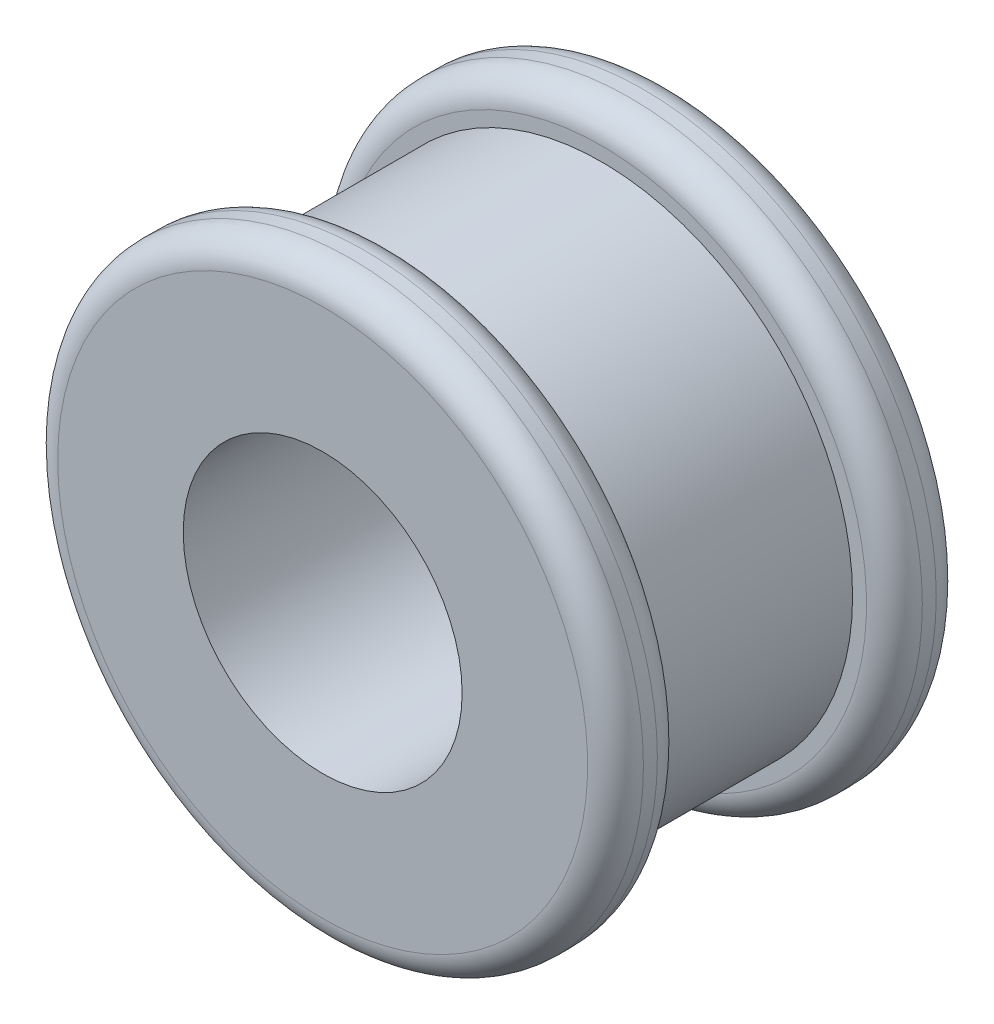
ISO-10303-21;
HEADER;
FILE_DESCRIPTION(('STEP AP214'),'2;1');
FILE_NAME('part.step','',(''),(''),'','','');
FILE_SCHEMA(('AUTOMOTIVE_DESIGN { 1 0 10303 214 1 1 1 1 }'));
ENDSEC;
DATA;
#1=APPLICATION_CONTEXT('core data for automotive mechanical design processes');
#2=APPLICATION_PROTOCOL_DEFINITION('international standard','automotive_design',2000,#1);
#3=PRODUCT_CONTEXT('',#1,'mechanical');
#4=PRODUCT('Part','Part','',(#3));
#5=PRODUCT_RELATED_PRODUCT_CATEGORY('part','',(#4));
#6=PRODUCT_DEFINITION_FORMATION('','',#4);
#7=PRODUCT_DEFINITION_CONTEXT('part definition',#1,'design');
#8=PRODUCT_DEFINITION('design','',#6,#7);
#9=PRODUCT_DEFINITION_SHAPE('','',#8);
#10=(LENGTH_UNIT() NAMED_UNIT(*) SI_UNIT(.MILLI.,.METRE.));
#11=(NAMED_UNIT(*) PLANE_ANGLE_UNIT() SI_UNIT($,.RADIAN.));
#12=(NAMED_UNIT(*) SI_UNIT($,.STERADIAN.) SOLID_ANGLE_UNIT());
#13=UNCERTAINTY_MEASURE_WITH_UNIT(LENGTH_MEASURE(1.E-05),#10,'distance_accuracy_value','');
#14=(GEOMETRIC_REPRESENTATION_CONTEXT(3) GLOBAL_UNCERTAINTY_ASSIGNED_CONTEXT((#13)) GLOBAL_UNIT_ASSIGNED_CONTEXT((#10,
#11,#12)) REPRESENTATION_CONTEXT('',''));
#15=CARTESIAN_POINT('',(0.,0.,0.));
#16=DIRECTION('',(0.,0.,1.));
#17=DIRECTION('',(1.,0.,0.));
#18=AXIS2_PLACEMENT_3D('',#15,#16,#17);
#19=CARTESIAN_POINT('',(0.,21.,0.));
#20=DIRECTION('',(0.,0.,-1.));
#21=DIRECTION('',(-1.,0.,0.));
#22=AXIS2_PLACEMENT_3D('',#19,#20,#21);
#23=PLANE('',#22);
#24=CARTESIAN_POINT('',(0.,0.,0.));
#25=DIRECTION('',(0.,0.,-1.));
#26=DIRECTION('',(-1.,0.,0.));
#27=AXIS2_PLACEMENT_3D('',#24,#25,#26);
#28=CIRCLE('',#27,19.);
#29=CARTESIAN_POINT('',(-19.,0.,0.));
#30=VERTEX_POINT('',#29);
#31=EDGE_CURVE('E10',#30,#30,#28,.F.);
#32=ORIENTED_EDGE('',*,*,#31,.T.);
#33=EDGE_LOOP('',(#32));
#34=FACE_BOUND('',#33,.T.);
#35=CARTESIAN_POINT('',(0.,0.,0.));
#36=DIRECTION('',(0.,0.,1.));
#37=DIRECTION('',(1.,0.,0.));
#38=AXIS2_PLACEMENT_3D('',#35,#36,#37);
#39=CIRCLE('',#38,10.);
#40=CARTESIAN_POINT('',(10.,0.,0.));
#41=VERTEX_POINT('',#40);
#42=EDGE_CURVE('E66',#41,#41,#39,.T.);
#43=ORIENTED_EDGE('',*,*,#42,.F.);
#44=EDGE_LOOP('',(#43));
#45=FACE_BOUND('',#44,.T.);
#46=ADVANCED_FACE('F34',(#34,#45),#23,.F.);
#47=CARTESIAN_POINT('',(0.,0.,0.));
#48=DIRECTION('',(0.,0.,1.));
#49=DIRECTION('',(1.,0.,0.));
#50=AXIS2_PLACEMENT_3D('',#47,#48,#49);
#51=CYLINDRICAL_SURFACE('',#50,10.);
#52=CARTESIAN_POINT('',(0.,0.,-25.));
#53=DIRECTION('',(0.,0.,1.));
#54=DIRECTION('',(1.,0.,0.));
#55=AXIS2_PLACEMENT_3D('',#52,#53,#54);
#56=CIRCLE('',#55,10.);
#57=CARTESIAN_POINT('',(10.,0.,-25.));
#58=VERTEX_POINT('',#57);
#59=EDGE_CURVE('E69',#58,#58,#56,.T.);
#60=ORIENTED_EDGE('',*,*,#59,.F.);
#61=EDGE_LOOP('',(#60));
#62=FACE_BOUND('',#61,.T.);
#63=ORIENTED_EDGE('',*,*,#42,.T.);
#64=EDGE_LOOP('',(#63));
#65=FACE_BOUND('',#64,.T.);
#66=ADVANCED_FACE('F99',(#62,#65),#51,.F.);
#67=CARTESIAN_POINT('',(0.,10.,-25.));
#68=DIRECTION('',(0.,0.,1.));
#69=DIRECTION('',(1.,0.,0.));
#70=AXIS2_PLACEMENT_3D('',#67,#68,#69);
#71=PLANE('',#70);
#72=CARTESIAN_POINT('',(0.,0.,-25.));
#73=DIRECTION('',(0.,0.,1.));
#74=DIRECTION('',(1.,0.,0.));
#75=AXIS2_PLACEMENT_3D('',#72,#73,#74);
#76=CIRCLE('',#75,19.);
#77=CARTESIAN_POINT('',(19.,0.,-25.));
#78=VERTEX_POINT('',#77);
#79=EDGE_CURVE('E57',#78,#78,#76,.F.);
#80=ORIENTED_EDGE('',*,*,#79,.T.);
#81=EDGE_LOOP('',(#80));
#82=FACE_BOUND('',#81,.T.);
#83=ORIENTED_EDGE('',*,*,#59,.T.);
#84=EDGE_LOOP('',(#83));
#85=FACE_BOUND('',#84,.T.);
#86=ADVANCED_FACE('F95',(#82,#85),#71,.F.);
#87=CARTESIAN_POINT('',(0.,0.,0.));
#88=DIRECTION('',(0.,0.,1.));
#89=DIRECTION('',(1.,0.,0.));
#90=AXIS2_PLACEMENT_3D('',#87,#88,#89);
#91=CYLINDRICAL_SURFACE('',#90,21.);
#92=CARTESIAN_POINT('',(0.,0.,-23.));
#93=DIRECTION('',(0.,0.,1.));
#94=DIRECTION('',(1.,0.,0.));
#95=AXIS2_PLACEMENT_3D('',#92,#93,#94);
#96=CIRCLE('',#95,21.);
#97=CARTESIAN_POINT('',(21.,0.,-23.));
#98=VERTEX_POINT('',#97);
#99=EDGE_CURVE('E60',#98,#98,#96,.T.);
#100=ORIENTED_EDGE('',*,*,#99,.T.);
#101=EDGE_LOOP('',(#100));
#102=FACE_BOUND('',#101,.T.);
#103=CARTESIAN_POINT('',(0.,0.,-22.));
#104=DIRECTION('',(0.,0.,-1.));
#105=DIRECTION('',(-1.,0.,0.));
#106=AXIS2_PLACEMENT_3D('',#103,#104,#105);
#107=CIRCLE('',#106,21.);
#108=CARTESIAN_POINT('',(-21.,0.,-22.));
#109=VERTEX_POINT('',#108);
#110=EDGE_CURVE('E63',#109,#109,#107,.T.);
#111=ORIENTED_EDGE('',*,*,#110,.T.);
#112=EDGE_LOOP('',(#111));
#113=FACE_BOUND('',#112,.T.);
#114=ADVANCED_FACE('F89',(#102,#113),#91,.T.);
#115=CARTESIAN_POINT('',(0.,21.,-20.));
#116=DIRECTION('',(0.,0.,-1.));
#117=DIRECTION('',(-1.,0.,0.));
#118=AXIS2_PLACEMENT_3D('',#115,#116,#117);
#119=PLANE('',#118);
#120=CARTESIAN_POINT('',(0.,0.,-20.));
#121=DIRECTION('',(0.,0.,-1.));
#122=DIRECTION('',(-1.,0.,0.));
#123=AXIS2_PLACEMENT_3D('',#120,#121,#122);
#124=CIRCLE('',#123,19.);
#125=CARTESIAN_POINT('',(-19.,0.,-20.));
#126=VERTEX_POINT('',#125);
#127=EDGE_CURVE('E54',#126,#126,#124,.F.);
#128=ORIENTED_EDGE('',*,*,#127,.T.);
#129=EDGE_LOOP('',(#128));
#130=FACE_BOUND('',#129,.T.);
#131=CARTESIAN_POINT('',(0.,0.,-20.));
#132=DIRECTION('',(0.,0.,1.));
#133=DIRECTION('',(1.,0.,0.));
#134=AXIS2_PLACEMENT_3D('',#131,#132,#133);
#135=CIRCLE('',#134,18.);
#136=CARTESIAN_POINT('',(18.,0.,-20.));
#137=VERTEX_POINT('',#136);
#138=EDGE_CURVE('E72',#137,#137,#135,.T.);
#139=ORIENTED_EDGE('',*,*,#138,.F.);
#140=EDGE_LOOP('',(#139));
#141=FACE_BOUND('',#140,.T.);
#142=ADVANCED_FACE('F84',(#130,#141),#119,.F.);
#143=CARTESIAN_POINT('',(0.,0.,0.));
#144=DIRECTION('',(0.,0.,1.));
#145=DIRECTION('',(1.,0.,0.));
#146=AXIS2_PLACEMENT_3D('',#143,#144,#145);
#147=CYLINDRICAL_SURFACE('',#146,18.);
#148=CARTESIAN_POINT('',(0.,0.,-5.));
#149=DIRECTION('',(0.,0.,1.));
#150=DIRECTION('',(1.,0.,0.));
#151=AXIS2_PLACEMENT_3D('',#148,#149,#150);
#152=CIRCLE('',#151,18.);
#153=CARTESIAN_POINT('',(18.,0.,-5.));
#154=VERTEX_POINT('',#153);
#155=EDGE_CURVE('E75',#154,#154,#152,.T.);
#156=ORIENTED_EDGE('',*,*,#155,.F.);
#157=EDGE_LOOP('',(#156));
#158=FACE_BOUND('',#157,.T.);
#159=ORIENTED_EDGE('',*,*,#138,.T.);
#160=EDGE_LOOP('',(#159));
#161=FACE_BOUND('',#160,.T.);
#162=ADVANCED_FACE('F81',(#158,#161),#147,.T.);
#163=CARTESIAN_POINT('',(0.,18.,-5.));
#164=DIRECTION('',(0.,0.,1.));
#165=DIRECTION('',(1.,0.,0.));
#166=AXIS2_PLACEMENT_3D('',#163,#164,#165);
#167=PLANE('',#166);
#168=CARTESIAN_POINT('',(0.,0.,-5.));
#169=DIRECTION('',(0.,0.,1.));
#170=DIRECTION('',(1.,0.,0.));
#171=AXIS2_PLACEMENT_3D('',#168,#169,#170);
#172=CIRCLE('',#171,19.);
#173=CARTESIAN_POINT('',(19.,0.,-5.));
#174=VERTEX_POINT('',#173);
#175=EDGE_CURVE('E41',#174,#174,#172,.F.);
#176=ORIENTED_EDGE('',*,*,#175,.T.);
#177=EDGE_LOOP('',(#176));
#178=FACE_BOUND('',#177,.T.);
#179=ORIENTED_EDGE('',*,*,#155,.T.);
#180=EDGE_LOOP('',(#179));
#181=FACE_BOUND('',#180,.T.);
#182=ADVANCED_FACE('F79',(#178,#181),#167,.F.);
#183=CARTESIAN_POINT('',(0.,0.,0.));
#184=DIRECTION('',(0.,0.,1.));
#185=DIRECTION('',(1.,0.,0.));
#186=AXIS2_PLACEMENT_3D('',#183,#184,#185);
#187=CYLINDRICAL_SURFACE('',#186,21.);
#188=CARTESIAN_POINT('',(0.,0.,-3.));
#189=DIRECTION('',(0.,0.,1.));
#190=DIRECTION('',(1.,0.,0.));
#191=AXIS2_PLACEMENT_3D('',#188,#189,#190);
#192=CIRCLE('',#191,21.);
#193=CARTESIAN_POINT('',(21.,0.,-3.));
#194=VERTEX_POINT('',#193);
#195=EDGE_CURVE('E45',#194,#194,#192,.T.);
#196=ORIENTED_EDGE('',*,*,#195,.T.);
#197=EDGE_LOOP('',(#196));
#198=FACE_BOUND('',#197,.T.);
#199=CARTESIAN_POINT('',(0.,0.,-2.));
#200=DIRECTION('',(0.,0.,-1.));
#201=DIRECTION('',(-1.,0.,0.));
#202=AXIS2_PLACEMENT_3D('',#199,#200,#201);
#203=CIRCLE('',#202,21.);
#204=CARTESIAN_POINT('',(-21.,0.,-2.));
#205=VERTEX_POINT('',#204);
#206=EDGE_CURVE('E49',#205,#205,#203,.T.);
#207=ORIENTED_EDGE('',*,*,#206,.T.);
#208=EDGE_LOOP('',(#207));
#209=FACE_BOUND('',#208,.T.);
#210=ADVANCED_FACE('F113',(#198,#209),#187,.T.);
#211=CARTESIAN_POINT('',(0.,0.,-23.));
#212=DIRECTION('',(0.,0.,1.));
#213=DIRECTION('',(1.,0.,0.));
#214=AXIS2_PLACEMENT_3D('',#211,#212,#213);
#215=TOROIDAL_SURFACE('',#214,19.,2.);
#216=ORIENTED_EDGE('',*,*,#79,.F.);
#217=EDGE_LOOP('',(#216));
#218=FACE_BOUND('',#217,.T.);
#219=ORIENTED_EDGE('',*,*,#99,.F.);
#220=EDGE_LOOP('',(#219));
#221=FACE_BOUND('',#220,.T.);
#222=ADVANCED_FACE('F109',(#218,#221),#215,.T.);
#223=CARTESIAN_POINT('',(0.,0.,-22.));
#224=DIRECTION('',(0.,0.,-1.));
#225=DIRECTION('',(-1.,0.,0.));
#226=AXIS2_PLACEMENT_3D('',#223,#224,#225);
#227=TOROIDAL_SURFACE('',#226,19.,2.);
#228=ORIENTED_EDGE('',*,*,#110,.F.);
#229=EDGE_LOOP('',(#228));
#230=FACE_BOUND('',#229,.T.);
#231=ORIENTED_EDGE('',*,*,#127,.F.);
#232=EDGE_LOOP('',(#231));
#233=FACE_BOUND('',#232,.T.);
#234=ADVANCED_FACE('F112',(#230,#233),#227,.T.);
#235=CARTESIAN_POINT('',(0.,0.,-3.));
#236=DIRECTION('',(0.,0.,1.));
#237=DIRECTION('',(1.,0.,0.));
#238=AXIS2_PLACEMENT_3D('',#235,#236,#237);
#239=TOROIDAL_SURFACE('',#238,19.,2.);
#240=ORIENTED_EDGE('',*,*,#175,.F.);
#241=EDGE_LOOP('',(#240));
#242=FACE_BOUND('',#241,.T.);
#243=ORIENTED_EDGE('',*,*,#195,.F.);
#244=EDGE_LOOP('',(#243));
#245=FACE_BOUND('',#244,.T.);
#246=ADVANCED_FACE('F116',(#242,#245),#239,.T.);
#247=CARTESIAN_POINT('',(0.,0.,-2.));
#248=DIRECTION('',(0.,0.,-1.));
#249=DIRECTION('',(-1.,0.,0.));
#250=AXIS2_PLACEMENT_3D('',#247,#248,#249);
#251=TOROIDAL_SURFACE('',#250,19.,2.);
#252=ORIENTED_EDGE('',*,*,#206,.F.);
#253=EDGE_LOOP('',(#252));
#254=FACE_BOUND('',#253,.T.);
#255=ORIENTED_EDGE('',*,*,#31,.F.);
#256=EDGE_LOOP('',(#255));
#257=FACE_BOUND('',#256,.T.);
#258=ADVANCED_FACE('F36',(#254,#257),#251,.T.);
#259=CLOSED_SHELL('',(#46,#66,#86,#114,#142,#162,#182,#210,#222,#234,#246,#258));
#260=MANIFOLD_SOLID_BREP('B2',#259);
#261=ADVANCED_BREP_SHAPE_REPRESENTATION('',(#18,#260),#14);
#262=SHAPE_DEFINITION_REPRESENTATION(#9,#261);
ENDSEC;
END-ISO-10303-21;
